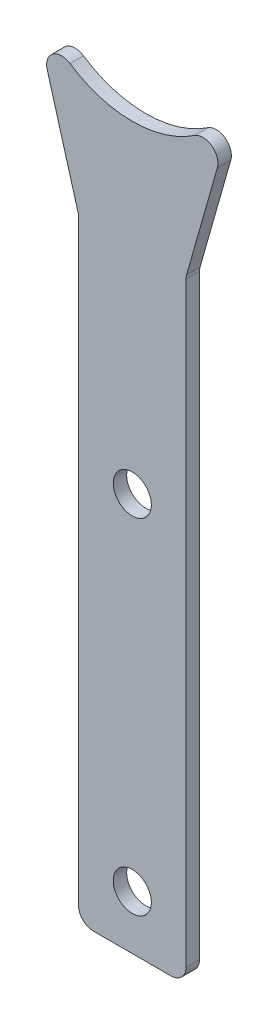
ISO-10303-21;
HEADER;
FILE_DESCRIPTION(('STEP AP214'),'2;1');
FILE_NAME('part.step','',(''),(''),'','','');
FILE_SCHEMA(('AUTOMOTIVE_DESIGN { 1 0 10303 214 1 1 1 1 }'));
ENDSEC;
DATA;
#1=APPLICATION_CONTEXT('core data for automotive mechanical design processes');
#2=APPLICATION_PROTOCOL_DEFINITION('international standard','automotive_design',2000,#1);
#3=PRODUCT_CONTEXT('',#1,'mechanical');
#4=PRODUCT('Part','Part','',(#3));
#5=PRODUCT_RELATED_PRODUCT_CATEGORY('part','',(#4));
#6=PRODUCT_DEFINITION_FORMATION('','',#4);
#7=PRODUCT_DEFINITION_CONTEXT('part definition',#1,'design');
#8=PRODUCT_DEFINITION('design','',#6,#7);
#9=PRODUCT_DEFINITION_SHAPE('','',#8);
#10=(LENGTH_UNIT() NAMED_UNIT(*) SI_UNIT(.MILLI.,.METRE.));
#11=(NAMED_UNIT(*) PLANE_ANGLE_UNIT() SI_UNIT($,.RADIAN.));
#12=(NAMED_UNIT(*) SI_UNIT($,.STERADIAN.) SOLID_ANGLE_UNIT());
#13=UNCERTAINTY_MEASURE_WITH_UNIT(LENGTH_MEASURE(1.E-05),#10,'distance_accuracy_value','');
#14=(GEOMETRIC_REPRESENTATION_CONTEXT(3) GLOBAL_UNCERTAINTY_ASSIGNED_CONTEXT((#13)) GLOBAL_UNIT_ASSIGNED_CONTEXT((#10,
#11,#12)) REPRESENTATION_CONTEXT('',''));
#15=CARTESIAN_POINT('',(0.,0.,0.));
#16=DIRECTION('',(0.,0.,1.));
#17=DIRECTION('',(1.,0.,0.));
#18=AXIS2_PLACEMENT_3D('',#15,#16,#17);
#19=CARTESIAN_POINT('',(-1.44263967348481,71.3066575766387,1.5875));
#20=DIRECTION('',(0.,0.,-1.));
#21=DIRECTION('',(-1.,0.,0.));
#22=AXIS2_PLACEMENT_3D('',#19,#20,#21);
#23=CYLINDRICAL_SURFACE('',#22,13.208);
#24=CARTESIAN_POINT('',(-1.44263967348481,71.3066575766387,0.));
#25=DIRECTION('',(0.,0.,1.));
#26=DIRECTION('',(1.,0.,0.));
#27=AXIS2_PLACEMENT_3D('',#24,#25,#26);
#28=CIRCLE('',#27,13.208);
#29=CARTESIAN_POINT('',(-8.78941206667904,60.3304925176302,0.));
#30=VERTEX_POINT('',#29);
#31=CARTESIAN_POINT('',(5.90413271970944,60.3304925176302,0.));
#32=VERTEX_POINT('',#31);
#33=EDGE_CURVE('E217',#30,#32,#28,.T.);
#34=ORIENTED_EDGE('',*,*,#33,.F.);
#35=DIRECTION('',(0.,0.,-1.));
#36=VECTOR('',#35,1.);
#37=CARTESIAN_POINT('',(-8.78941206667905,60.3304925176302,1.5875));
#38=LINE('',#37,#36);
#39=CARTESIAN_POINT('',(-8.78941206667904,60.3304925176302,1.5875));
#40=VERTEX_POINT('',#39);
#41=EDGE_CURVE('E193',#30,#40,#38,.F.);
#42=ORIENTED_EDGE('',*,*,#41,.T.);
#43=CARTESIAN_POINT('',(-1.44263967348481,71.3066575766387,1.5875));
#44=DIRECTION('',(0.,0.,1.));
#45=DIRECTION('',(1.,0.,0.));
#46=AXIS2_PLACEMENT_3D('',#43,#44,#45);
#47=CIRCLE('',#46,13.208);
#48=CARTESIAN_POINT('',(5.90413271970944,60.3304925176302,1.5875));
#49=VERTEX_POINT('',#48);
#50=EDGE_CURVE('E219',#40,#49,#47,.T.);
#51=ORIENTED_EDGE('',*,*,#50,.T.);
#52=DIRECTION('',(0.,0.,-1.));
#53=VECTOR('',#52,1.);
#54=CARTESIAN_POINT('',(5.90413271970944,60.3304925176302,1.5875));
#55=LINE('',#54,#53);
#56=EDGE_CURVE('E190',#49,#32,#55,.T.);
#57=ORIENTED_EDGE('',*,*,#56,.T.);
#58=EDGE_LOOP('',(#34,#42,#51,#57));
#59=FACE_BOUND('',#58,.T.);
#60=ADVANCED_FACE('F37',(#59),#23,.F.);
#61=CARTESIAN_POINT('',(4.7596766428546,1.35654170097716,1.5875));
#62=DIRECTION('',(0.961703388462805,0.274092306749312,0.));
#63=DIRECTION('',(-0.274092306749312,0.961703388462805,0.));
#64=AXIS2_PLACEMENT_3D('',#61,#62,#63);
#65=PLANE('',#64);
#66=DIRECTION('',(0.274092306749312,-0.961703388462805,0.));
#67=VECTOR('',#66,1.);
#68=CARTESIAN_POINT('',(4.7596766428546,1.35654170097716,0.));
#69=LINE('',#68,#67);
#70=CARTESIAN_POINT('',(-11.4883092827575,58.3655957152096,0.));
#71=VERTEX_POINT('',#70);
#72=CARTESIAN_POINT('',(-7.86073104879794,45.6375687198969,0.));
#73=VERTEX_POINT('',#72);
#74=EDGE_CURVE('E221',#71,#73,#69,.T.);
#75=ORIENTED_EDGE('',*,*,#74,.T.);
#76=DIRECTION('',(0.,0.,-1.));
#77=VECTOR('',#76,1.);
#78=CARTESIAN_POINT('',(-7.86073104879794,45.6375687198968,1.5875));
#79=LINE('',#78,#77);
#80=CARTESIAN_POINT('',(-7.86073104879794,45.6375687198969,1.5875));
#81=VERTEX_POINT('',#80);
#82=EDGE_CURVE('E184',#73,#81,#79,.F.);
#83=ORIENTED_EDGE('',*,*,#82,.T.);
#84=DIRECTION('',(0.274092306749312,-0.961703388462805,0.));
#85=VECTOR('',#84,1.);
#86=CARTESIAN_POINT('',(4.7596766428546,1.35654170097716,1.5875));
#87=LINE('',#86,#85);
#88=CARTESIAN_POINT('',(-11.4883092827575,58.3655957152096,1.5875));
#89=VERTEX_POINT('',#88);
#90=EDGE_CURVE('E244',#89,#81,#87,.T.);
#91=ORIENTED_EDGE('',*,*,#90,.F.);
#92=DIRECTION('',(0.,0.,1.));
#93=VECTOR('',#92,1.);
#94=CARTESIAN_POINT('',(-11.4883092827575,58.3655957152096,0.));
#95=LINE('',#94,#93);
#96=EDGE_CURVE('E181',#89,#71,#95,.F.);
#97=ORIENTED_EDGE('',*,*,#96,.T.);
#98=EDGE_LOOP('',(#75,#83,#91,#97));
#99=FACE_BOUND('',#98,.T.);
#100=ADVANCED_FACE('F279',(#99),#65,.F.);
#101=CARTESIAN_POINT('',(-7.7926396734848,0.,1.5875));
#102=DIRECTION('',(-1.,0.,0.));
#103=DIRECTION('',(0.,0.,1.));
#104=AXIS2_PLACEMENT_3D('',#101,#102,#103);
#105=PLANE('',#104);
#106=DIRECTION('',(0.,1.,0.));
#107=VECTOR('',#106,1.);
#108=CARTESIAN_POINT('',(-7.7926396734848,0.,0.));
#109=LINE('',#108,#107);
#110=CARTESIAN_POINT('',(-7.7926396734848,-25.2133424233613,0.));
#111=VERTEX_POINT('',#110);
#112=CARTESIAN_POINT('',(-7.7926396734848,45.1502325984966,0.));
#113=VERTEX_POINT('',#112);
#114=EDGE_CURVE('E147',#111,#113,#109,.T.);
#115=ORIENTED_EDGE('',*,*,#114,.F.);
#116=DIRECTION('',(0.,0.,-1.));
#117=VECTOR('',#116,1.);
#118=CARTESIAN_POINT('',(-7.7926396734848,-25.2133424233613,1.5875));
#119=LINE('',#118,#117);
#120=CARTESIAN_POINT('',(-7.7926396734848,-25.2133424233613,1.5875));
#121=VERTEX_POINT('',#120);
#122=EDGE_CURVE('E168',#111,#121,#119,.F.);
#123=ORIENTED_EDGE('',*,*,#122,.T.);
#124=DIRECTION('',(0.,1.,0.));
#125=VECTOR('',#124,1.);
#126=CARTESIAN_POINT('',(-7.7926396734848,0.,1.5875));
#127=LINE('',#126,#125);
#128=CARTESIAN_POINT('',(-7.7926396734848,45.1502325984966,1.5875));
#129=VERTEX_POINT('',#128);
#130=EDGE_CURVE('E242',#121,#129,#127,.T.);
#131=ORIENTED_EDGE('',*,*,#130,.T.);
#132=DIRECTION('',(0.,0.,-1.));
#133=VECTOR('',#132,1.);
#134=CARTESIAN_POINT('',(-7.7926396734848,45.1502325984966,1.5875));
#135=LINE('',#134,#133);
#136=EDGE_CURVE('E165',#129,#113,#135,.T.);
#137=ORIENTED_EDGE('',*,*,#136,.T.);
#138=EDGE_LOOP('',(#115,#123,#131,#137));
#139=FACE_BOUND('',#138,.T.);
#140=ADVANCED_FACE('F235',(#139),#105,.T.);
#141=CARTESIAN_POINT('',(0.,-26.9913424233613,1.5875));
#142=DIRECTION('',(0.,-1.,0.));
#143=DIRECTION('',(0.,0.,-1.));
#144=AXIS2_PLACEMENT_3D('',#141,#142,#143);
#145=PLANE('',#144);
#146=DIRECTION('',(-1.,0.,0.));
#147=VECTOR('',#146,1.);
#148=CARTESIAN_POINT('',(0.,-26.9913424233613,1.5875));
#149=LINE('',#148,#147);
#150=CARTESIAN_POINT('',(3.1293603265152,-26.9913424233613,1.5875));
#151=VERTEX_POINT('',#150);
#152=CARTESIAN_POINT('',(-6.0146396734848,-26.9913424233613,1.5875));
#153=VERTEX_POINT('',#152);
#154=EDGE_CURVE('E241',#151,#153,#149,.T.);
#155=ORIENTED_EDGE('',*,*,#154,.T.);
#156=DIRECTION('',(0.,0.,-1.));
#157=VECTOR('',#156,1.);
#158=CARTESIAN_POINT('',(-6.0146396734848,-26.9913424233613,1.5875));
#159=LINE('',#158,#157);
#160=CARTESIAN_POINT('',(-6.0146396734848,-26.9913424233613,0.));
#161=VERTEX_POINT('',#160);
#162=EDGE_CURVE('E146',#153,#161,#159,.T.);
#163=ORIENTED_EDGE('',*,*,#162,.T.);
#164=DIRECTION('',(-1.,0.,0.));
#165=VECTOR('',#164,1.);
#166=CARTESIAN_POINT('',(0.,-26.9913424233613,0.));
#167=LINE('',#166,#165);
#168=CARTESIAN_POINT('',(3.1293603265152,-26.9913424233613,0.));
#169=VERTEX_POINT('',#168);
#170=EDGE_CURVE('E129',#169,#161,#167,.T.);
#171=ORIENTED_EDGE('',*,*,#170,.F.);
#172=DIRECTION('',(0.,0.,-1.));
#173=VECTOR('',#172,1.);
#174=CARTESIAN_POINT('',(3.1293603265152,-26.9913424233613,1.5875));
#175=LINE('',#174,#173);
#176=EDGE_CURVE('E143',#169,#151,#175,.F.);
#177=ORIENTED_EDGE('',*,*,#176,.T.);
#178=EDGE_LOOP('',(#155,#163,#171,#177));
#179=FACE_BOUND('',#178,.T.);
#180=ADVANCED_FACE('F142',(#179),#145,.T.);
#181=CARTESIAN_POINT('',(4.9073603265152,0.,1.5875));
#182=DIRECTION('',(-1.,0.,0.));
#183=DIRECTION('',(0.,0.,1.));
#184=AXIS2_PLACEMENT_3D('',#181,#182,#183);
#185=PLANE('',#184);
#186=DIRECTION('',(0.,1.,0.));
#187=VECTOR('',#186,1.);
#188=CARTESIAN_POINT('',(4.9073603265152,0.,1.5875));
#189=LINE('',#188,#187);
#190=CARTESIAN_POINT('',(4.9073603265152,-25.2133424233613,1.5875));
#191=VERTEX_POINT('',#190);
#192=CARTESIAN_POINT('',(4.9073603265152,45.1502325984966,1.5875));
#193=VERTEX_POINT('',#192);
#194=EDGE_CURVE('E156',#191,#193,#189,.T.);
#195=ORIENTED_EDGE('',*,*,#194,.F.);
#196=DIRECTION('',(0.,0.,-1.));
#197=VECTOR('',#196,1.);
#198=CARTESIAN_POINT('',(4.9073603265152,-25.2133424233613,0.));
#199=LINE('',#198,#197);
#200=CARTESIAN_POINT('',(4.9073603265152,-25.2133424233613,0.));
#201=VERTEX_POINT('',#200);
#202=EDGE_CURVE('E179',#191,#201,#199,.T.);
#203=ORIENTED_EDGE('',*,*,#202,.T.);
#204=DIRECTION('',(0.,1.,0.));
#205=VECTOR('',#204,1.);
#206=CARTESIAN_POINT('',(4.9073603265152,0.,0.));
#207=LINE('',#206,#205);
#208=CARTESIAN_POINT('',(4.9073603265152,45.1502325984966,0.));
#209=VERTEX_POINT('',#208);
#210=EDGE_CURVE('E131',#201,#209,#207,.T.);
#211=ORIENTED_EDGE('',*,*,#210,.T.);
#212=DIRECTION('',(0.,0.,-1.));
#213=VECTOR('',#212,1.);
#214=CARTESIAN_POINT('',(4.9073603265152,45.1502325984966,1.5875));
#215=LINE('',#214,#213);
#216=EDGE_CURVE('E177',#209,#193,#215,.F.);
#217=ORIENTED_EDGE('',*,*,#216,.T.);
#218=EDGE_LOOP('',(#195,#203,#211,#217));
#219=FACE_BOUND('',#218,.T.);
#220=ADVANCED_FACE('F204',(#219),#185,.F.);
#221=CARTESIAN_POINT('',(-7.42819478373196,2.11708835352101,1.5875));
#222=DIRECTION('',(-0.961703388462805,0.274092306749312,0.));
#223=DIRECTION('',(-0.274092306749312,-0.961703388462805,0.));
#224=AXIS2_PLACEMENT_3D('',#221,#222,#223);
#225=PLANE('',#224);
#226=DIRECTION('',(0.274092306749312,0.961703388462805,0.));
#227=VECTOR('',#226,1.);
#228=CARTESIAN_POINT('',(-7.42819478373196,2.11708835352101,1.5875));
#229=LINE('',#228,#227);
#230=CARTESIAN_POINT('',(4.97545170182833,45.6375687198968,1.5875));
#231=VERTEX_POINT('',#230);
#232=CARTESIAN_POINT('',(8.60302993578785,58.3655957152096,1.5875));
#233=VERTEX_POINT('',#232);
#234=EDGE_CURVE('E152',#231,#233,#229,.T.);
#235=ORIENTED_EDGE('',*,*,#234,.F.);
#236=DIRECTION('',(0.,0.,-1.));
#237=VECTOR('',#236,1.);
#238=CARTESIAN_POINT('',(4.97545170182833,45.6375687198968,0.));
#239=LINE('',#238,#237);
#240=CARTESIAN_POINT('',(4.97545170182833,45.6375687198968,0.));
#241=VERTEX_POINT('',#240);
#242=EDGE_CURVE('E187',#231,#241,#239,.T.);
#243=ORIENTED_EDGE('',*,*,#242,.T.);
#244=DIRECTION('',(0.274092306749312,0.961703388462805,0.));
#245=VECTOR('',#244,1.);
#246=CARTESIAN_POINT('',(-7.42819478373196,2.11708835352101,0.));
#247=LINE('',#246,#245);
#248=CARTESIAN_POINT('',(8.60302993578785,58.3655957152096,0.));
#249=VERTEX_POINT('',#248);
#250=EDGE_CURVE('E159',#241,#249,#247,.T.);
#251=ORIENTED_EDGE('',*,*,#250,.T.);
#252=DIRECTION('',(0.,0.,1.));
#253=VECTOR('',#252,1.);
#254=CARTESIAN_POINT('',(8.60302993578785,58.3655957152096,1.5875));
#255=LINE('',#254,#253);
#256=EDGE_CURVE('E52',#249,#233,#255,.T.);
#257=ORIENTED_EDGE('',*,*,#256,.T.);
#258=EDGE_LOOP('',(#235,#243,#251,#257));
#259=FACE_BOUND('',#258,.T.);
#260=ADVANCED_FACE('F206',(#259),#225,.F.);
#261=CARTESIAN_POINT('',(0.,0.,1.5875));
#262=DIRECTION('',(0.,0.,1.));
#263=DIRECTION('',(1.,0.,0.));
#264=AXIS2_PLACEMENT_3D('',#261,#262,#263);
#265=PLANE('',#264);
#266=CARTESIAN_POINT('',(-1.44263967348481,-20.6413424233613,1.5875));
#267=DIRECTION('',(0.,0.,1.));
#268=DIRECTION('',(1.,0.,0.));
#269=AXIS2_PLACEMENT_3D('',#266,#267,#268);
#270=CIRCLE('',#269,2.24999999999999);
#271=CARTESIAN_POINT('',(0.807360326515182,-20.6413424233613,1.5875));
#272=VERTEX_POINT('',#271);
#273=EDGE_CURVE('E255',#272,#272,#270,.T.);
#274=ORIENTED_EDGE('',*,*,#273,.F.);
#275=EDGE_LOOP('',(#274));
#276=FACE_BOUND('',#275,.T.);
#277=CARTESIAN_POINT('',(-1.44263967348481,19.9986575766387,1.5875));
#278=DIRECTION('',(0.,0.,1.));
#279=DIRECTION('',(1.,0.,0.));
#280=AXIS2_PLACEMENT_3D('',#277,#278,#279);
#281=CIRCLE('',#280,2.24999999999999);
#282=CARTESIAN_POINT('',(0.807360326515182,19.9986575766387,1.5875));
#283=VERTEX_POINT('',#282);
#284=EDGE_CURVE('E227',#283,#283,#281,.T.);
#285=ORIENTED_EDGE('',*,*,#284,.F.);
#286=EDGE_LOOP('',(#285));
#287=FACE_BOUND('',#286,.T.);
#288=ORIENTED_EDGE('',*,*,#130,.F.);
#289=CARTESIAN_POINT('',(-6.0146396734848,-25.2133424233613,1.5875));
#290=DIRECTION('',(0.,0.,1.));
#291=DIRECTION('',(1.,0.,0.));
#292=AXIS2_PLACEMENT_3D('',#289,#290,#291);
#293=CIRCLE('',#292,1.778);
#294=EDGE_CURVE('E175',#121,#153,#293,.T.);
#295=ORIENTED_EDGE('',*,*,#294,.T.);
#296=ORIENTED_EDGE('',*,*,#154,.F.);
#297=CARTESIAN_POINT('',(3.1293603265152,-25.2133424233613,1.5875));
#298=DIRECTION('',(0.,0.,1.));
#299=DIRECTION('',(1.,0.,0.));
#300=AXIS2_PLACEMENT_3D('',#297,#298,#299);
#301=CIRCLE('',#300,1.778);
#302=EDGE_CURVE('E151',#151,#191,#301,.T.);
#303=ORIENTED_EDGE('',*,*,#302,.T.);
#304=ORIENTED_EDGE('',*,*,#194,.T.);
#305=CARTESIAN_POINT('',(6.6853603265152,45.1502325984966,1.5875));
#306=DIRECTION('',(0.,0.,1.));
#307=DIRECTION('',(1.,0.,0.));
#308=AXIS2_PLACEMENT_3D('',#305,#306,#307);
#309=CIRCLE('',#308,1.778);
#310=EDGE_CURVE('E11',#193,#231,#309,.F.);
#311=ORIENTED_EDGE('',*,*,#310,.T.);
#312=ORIENTED_EDGE('',*,*,#234,.T.);
#313=CARTESIAN_POINT('',(6.89312131110098,58.8529318366099,1.5875));
#314=DIRECTION('',(0.,0.,1.));
#315=DIRECTION('',(1.,0.,0.));
#316=AXIS2_PLACEMENT_3D('',#313,#314,#315);
#317=CIRCLE('',#316,1.778);
#318=EDGE_CURVE('E170',#233,#49,#317,.T.);
#319=ORIENTED_EDGE('',*,*,#318,.T.);
#320=ORIENTED_EDGE('',*,*,#50,.F.);
#321=CARTESIAN_POINT('',(-9.77840065807058,58.8529318366099,1.5875));
#322=DIRECTION('',(0.,0.,1.));
#323=DIRECTION('',(1.,0.,0.));
#324=AXIS2_PLACEMENT_3D('',#321,#322,#323);
#325=CIRCLE('',#324,1.778);
#326=EDGE_CURVE('E172',#40,#89,#325,.T.);
#327=ORIENTED_EDGE('',*,*,#326,.T.);
#328=ORIENTED_EDGE('',*,*,#90,.T.);
#329=CARTESIAN_POINT('',(-9.5706396734848,45.1502325984966,1.5875));
#330=DIRECTION('',(0.,0.,1.));
#331=DIRECTION('',(1.,0.,0.));
#332=AXIS2_PLACEMENT_3D('',#329,#330,#331);
#333=CIRCLE('',#332,1.778);
#334=EDGE_CURVE('E197',#81,#129,#333,.F.);
#335=ORIENTED_EDGE('',*,*,#334,.T.);
#336=EDGE_LOOP('',(#288,#295,#296,#303,#304,#311,#312,#319,#320,#327,#328,#335));
#337=FACE_BOUND('',#336,.T.);
#338=ADVANCED_FACE('F209',(#276,#287,#337),#265,.T.);
#339=CARTESIAN_POINT('',(0.,0.,0.));
#340=DIRECTION('',(0.,0.,1.));
#341=DIRECTION('',(1.,0.,0.));
#342=AXIS2_PLACEMENT_3D('',#339,#340,#341);
#343=PLANE('',#342);
#344=CARTESIAN_POINT('',(-1.44263967348481,-20.6413424233613,0.));
#345=DIRECTION('',(0.,0.,1.));
#346=DIRECTION('',(1.,0.,0.));
#347=AXIS2_PLACEMENT_3D('',#344,#345,#346);
#348=CIRCLE('',#347,2.25);
#349=CARTESIAN_POINT('',(0.807360326515194,-20.6413424233613,0.));
#350=VERTEX_POINT('',#349);
#351=EDGE_CURVE('E252',#350,#350,#348,.T.);
#352=ORIENTED_EDGE('',*,*,#351,.T.);
#353=EDGE_LOOP('',(#352));
#354=FACE_BOUND('',#353,.T.);
#355=CARTESIAN_POINT('',(-1.44263967348481,19.9986575766387,0.));
#356=DIRECTION('',(0.,0.,1.));
#357=DIRECTION('',(1.,0.,0.));
#358=AXIS2_PLACEMENT_3D('',#355,#356,#357);
#359=CIRCLE('',#358,2.25);
#360=CARTESIAN_POINT('',(0.807360326515193,19.9986575766387,0.));
#361=VERTEX_POINT('',#360);
#362=EDGE_CURVE('E222',#361,#361,#359,.T.);
#363=ORIENTED_EDGE('',*,*,#362,.T.);
#364=EDGE_LOOP('',(#363));
#365=FACE_BOUND('',#364,.T.);
#366=ORIENTED_EDGE('',*,*,#170,.T.);
#367=CARTESIAN_POINT('',(-6.0146396734848,-25.2133424233613,0.));
#368=DIRECTION('',(0.,0.,1.));
#369=DIRECTION('',(1.,0.,0.));
#370=AXIS2_PLACEMENT_3D('',#367,#368,#369);
#371=CIRCLE('',#370,1.778);
#372=EDGE_CURVE('E136',#161,#111,#371,.F.);
#373=ORIENTED_EDGE('',*,*,#372,.T.);
#374=ORIENTED_EDGE('',*,*,#114,.T.);
#375=CARTESIAN_POINT('',(-9.5706396734848,45.1502325984966,0.));
#376=DIRECTION('',(0.,0.,1.));
#377=DIRECTION('',(1.,0.,0.));
#378=AXIS2_PLACEMENT_3D('',#375,#376,#377);
#379=CIRCLE('',#378,1.778);
#380=EDGE_CURVE('E195',#113,#73,#379,.T.);
#381=ORIENTED_EDGE('',*,*,#380,.T.);
#382=ORIENTED_EDGE('',*,*,#74,.F.);
#383=CARTESIAN_POINT('',(-9.77840065807058,58.8529318366099,0.));
#384=DIRECTION('',(0.,0.,1.));
#385=DIRECTION('',(1.,0.,0.));
#386=AXIS2_PLACEMENT_3D('',#383,#384,#385);
#387=CIRCLE('',#386,1.778);
#388=EDGE_CURVE('E137',#71,#30,#387,.F.);
#389=ORIENTED_EDGE('',*,*,#388,.T.);
#390=ORIENTED_EDGE('',*,*,#33,.T.);
#391=CARTESIAN_POINT('',(6.89312131110098,58.8529318366099,0.));
#392=DIRECTION('',(0.,0.,1.));
#393=DIRECTION('',(1.,0.,0.));
#394=AXIS2_PLACEMENT_3D('',#391,#392,#393);
#395=CIRCLE('',#394,1.778);
#396=EDGE_CURVE('E154',#32,#249,#395,.F.);
#397=ORIENTED_EDGE('',*,*,#396,.T.);
#398=ORIENTED_EDGE('',*,*,#250,.F.);
#399=CARTESIAN_POINT('',(6.6853603265152,45.1502325984966,0.));
#400=DIRECTION('',(0.,0.,1.));
#401=DIRECTION('',(1.,0.,0.));
#402=AXIS2_PLACEMENT_3D('',#399,#400,#401);
#403=CIRCLE('',#402,1.778);
#404=EDGE_CURVE('E45',#241,#209,#403,.T.);
#405=ORIENTED_EDGE('',*,*,#404,.T.);
#406=ORIENTED_EDGE('',*,*,#210,.F.);
#407=CARTESIAN_POINT('',(3.1293603265152,-25.2133424233613,0.));
#408=DIRECTION('',(0.,0.,1.));
#409=DIRECTION('',(1.,0.,0.));
#410=AXIS2_PLACEMENT_3D('',#407,#408,#409);
#411=CIRCLE('',#410,1.778);
#412=EDGE_CURVE('E126',#201,#169,#411,.F.);
#413=ORIENTED_EDGE('',*,*,#412,.T.);
#414=EDGE_LOOP('',(#366,#373,#374,#381,#382,#389,#390,#397,#398,#405,#406,#413));
#415=FACE_BOUND('',#414,.T.);
#416=ADVANCED_FACE('F128',(#354,#365,#415),#343,.F.);
#417=CARTESIAN_POINT('',(-6.0146396734848,-25.2133424233613,1.5875));
#418=DIRECTION('',(0.,0.,-1.));
#419=DIRECTION('',(-1.,0.,0.));
#420=AXIS2_PLACEMENT_3D('',#417,#418,#419);
#421=CYLINDRICAL_SURFACE('',#420,1.778);
#422=ORIENTED_EDGE('',*,*,#294,.F.);
#423=ORIENTED_EDGE('',*,*,#122,.F.);
#424=ORIENTED_EDGE('',*,*,#372,.F.);
#425=ORIENTED_EDGE('',*,*,#162,.F.);
#426=EDGE_LOOP('',(#422,#423,#424,#425));
#427=FACE_BOUND('',#426,.T.);
#428=ADVANCED_FACE('F240',(#427),#421,.T.);
#429=CARTESIAN_POINT('',(3.1293603265152,-25.2133424233613,1.5875));
#430=DIRECTION('',(0.,0.,1.));
#431=DIRECTION('',(1.,0.,0.));
#432=AXIS2_PLACEMENT_3D('',#429,#430,#431);
#433=CYLINDRICAL_SURFACE('',#432,1.778);
#434=ORIENTED_EDGE('',*,*,#302,.F.);
#435=ORIENTED_EDGE('',*,*,#176,.F.);
#436=ORIENTED_EDGE('',*,*,#412,.F.);
#437=ORIENTED_EDGE('',*,*,#202,.F.);
#438=EDGE_LOOP('',(#434,#435,#436,#437));
#439=FACE_BOUND('',#438,.T.);
#440=ADVANCED_FACE('F150',(#439),#433,.T.);
#441=CARTESIAN_POINT('',(-9.5706396734848,45.1502325984966,1.5875));
#442=DIRECTION('',(0.,0.,-1.));
#443=DIRECTION('',(-1.,0.,0.));
#444=AXIS2_PLACEMENT_3D('',#441,#442,#443);
#445=CYLINDRICAL_SURFACE('',#444,1.778);
#446=ORIENTED_EDGE('',*,*,#334,.F.);
#447=ORIENTED_EDGE('',*,*,#82,.F.);
#448=ORIENTED_EDGE('',*,*,#380,.F.);
#449=ORIENTED_EDGE('',*,*,#136,.F.);
#450=EDGE_LOOP('',(#446,#447,#448,#449));
#451=FACE_BOUND('',#450,.T.);
#452=ADVANCED_FACE('F292',(#451),#445,.F.);
#453=CARTESIAN_POINT('',(6.6853603265152,45.1502325984966,1.5875));
#454=DIRECTION('',(0.,0.,1.));
#455=DIRECTION('',(1.,0.,0.));
#456=AXIS2_PLACEMENT_3D('',#453,#454,#455);
#457=CYLINDRICAL_SURFACE('',#456,1.778);
#458=ORIENTED_EDGE('',*,*,#310,.F.);
#459=ORIENTED_EDGE('',*,*,#216,.F.);
#460=ORIENTED_EDGE('',*,*,#404,.F.);
#461=ORIENTED_EDGE('',*,*,#242,.F.);
#462=EDGE_LOOP('',(#458,#459,#460,#461));
#463=FACE_BOUND('',#462,.T.);
#464=ADVANCED_FACE('F205',(#463),#457,.F.);
#465=CARTESIAN_POINT('',(-9.77840065807058,58.8529318366099,1.5875));
#466=DIRECTION('',(0.,0.,-1.));
#467=DIRECTION('',(-1.,0.,0.));
#468=AXIS2_PLACEMENT_3D('',#465,#466,#467);
#469=CYLINDRICAL_SURFACE('',#468,1.778);
#470=ORIENTED_EDGE('',*,*,#326,.F.);
#471=ORIENTED_EDGE('',*,*,#41,.F.);
#472=ORIENTED_EDGE('',*,*,#388,.F.);
#473=ORIENTED_EDGE('',*,*,#96,.F.);
#474=EDGE_LOOP('',(#470,#471,#472,#473));
#475=FACE_BOUND('',#474,.T.);
#476=ADVANCED_FACE('F276',(#475),#469,.T.);
#477=CARTESIAN_POINT('',(6.89312131110098,58.8529318366099,1.5875));
#478=DIRECTION('',(0.,0.,-1.));
#479=DIRECTION('',(-1.,0.,0.));
#480=AXIS2_PLACEMENT_3D('',#477,#478,#479);
#481=CYLINDRICAL_SURFACE('',#480,1.778);
#482=ORIENTED_EDGE('',*,*,#318,.F.);
#483=ORIENTED_EDGE('',*,*,#256,.F.);
#484=ORIENTED_EDGE('',*,*,#396,.F.);
#485=ORIENTED_EDGE('',*,*,#56,.F.);
#486=EDGE_LOOP('',(#482,#483,#484,#485));
#487=FACE_BOUND('',#486,.T.);
#488=ADVANCED_FACE('F39',(#487),#481,.T.);
#489=CARTESIAN_POINT('',(-1.44263967348481,19.9986575766387,1.5875));
#490=DIRECTION('',(0.,0.,1.));
#491=DIRECTION('',(1.,0.,0.));
#492=AXIS2_PLACEMENT_3D('',#489,#490,#491);
#493=CYLINDRICAL_SURFACE('',#492,2.24999999999999);
#494=ORIENTED_EDGE('',*,*,#362,.F.);
#495=EDGE_LOOP('',(#494));
#496=FACE_BOUND('',#495,.T.);
#497=ORIENTED_EDGE('',*,*,#284,.T.);
#498=EDGE_LOOP('',(#497));
#499=FACE_BOUND('',#498,.T.);
#500=ADVANCED_FACE('F266',(#496,#499),#493,.F.);
#501=CARTESIAN_POINT('',(-1.44263967348481,-20.6413424233613,1.5875));
#502=DIRECTION('',(0.,0.,1.));
#503=DIRECTION('',(1.,0.,0.));
#504=AXIS2_PLACEMENT_3D('',#501,#502,#503);
#505=CYLINDRICAL_SURFACE('',#504,2.24999999999999);
#506=ORIENTED_EDGE('',*,*,#351,.F.);
#507=EDGE_LOOP('',(#506));
#508=FACE_BOUND('',#507,.T.);
#509=ORIENTED_EDGE('',*,*,#273,.T.);
#510=EDGE_LOOP('',(#509));
#511=FACE_BOUND('',#510,.T.);
#512=ADVANCED_FACE('F259',(#508,#511),#505,.F.);
#513=CLOSED_SHELL('',(#60,#100,#140,#180,#220,#260,#338,#416,#428,#440,#452,#464,#476,#488,#500,#512));
#514=MANIFOLD_SOLID_BREP('B2',#513);
#515=ADVANCED_BREP_SHAPE_REPRESENTATION('',(#18,#514),#14);
#516=SHAPE_DEFINITION_REPRESENTATION(#9,#515);
ENDSEC;
END-ISO-10303-21;
